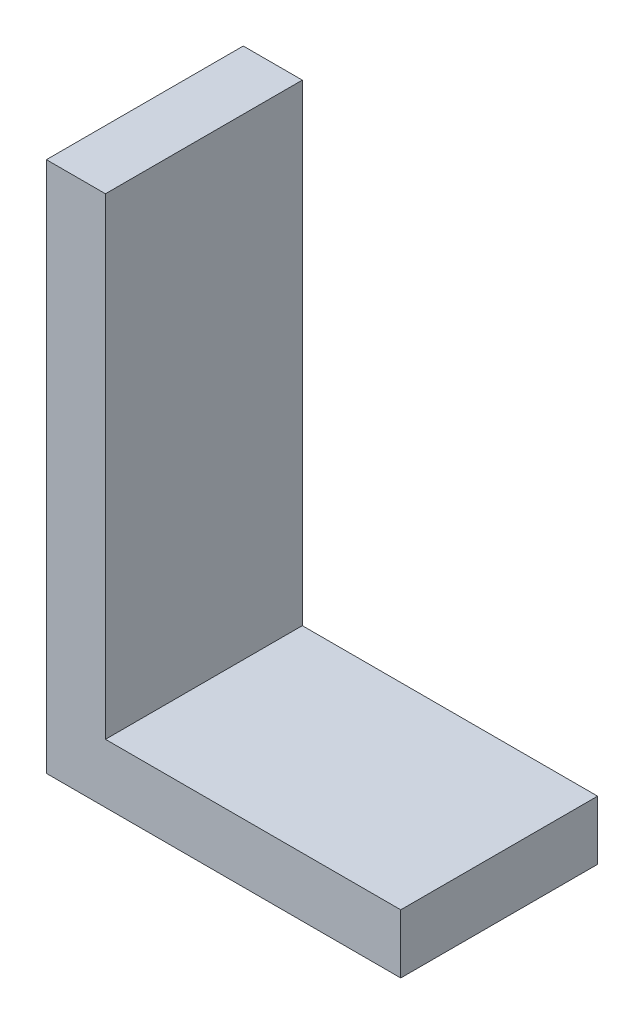
ISO-10303-21;
HEADER;
FILE_DESCRIPTION(('STEP AP214'),'2;1');
FILE_NAME('part.step','',(''),(''),'','','');
FILE_SCHEMA(('AUTOMOTIVE_DESIGN { 1 0 10303 214 1 1 1 1 }'));
ENDSEC;
DATA;
#1=APPLICATION_CONTEXT('core data for automotive mechanical design processes');
#2=APPLICATION_PROTOCOL_DEFINITION('international standard','automotive_design',2000,#1);
#3=PRODUCT_CONTEXT('',#1,'mechanical');
#4=PRODUCT('Part','Part','',(#3));
#5=PRODUCT_RELATED_PRODUCT_CATEGORY('part','',(#4));
#6=PRODUCT_DEFINITION_FORMATION('','',#4);
#7=PRODUCT_DEFINITION_CONTEXT('part definition',#1,'design');
#8=PRODUCT_DEFINITION('design','',#6,#7);
#9=PRODUCT_DEFINITION_SHAPE('','',#8);
#10=(LENGTH_UNIT() NAMED_UNIT(*) SI_UNIT(.MILLI.,.METRE.));
#11=(NAMED_UNIT(*) PLANE_ANGLE_UNIT() SI_UNIT($,.RADIAN.));
#12=(NAMED_UNIT(*) SI_UNIT($,.STERADIAN.) SOLID_ANGLE_UNIT());
#13=UNCERTAINTY_MEASURE_WITH_UNIT(LENGTH_MEASURE(1.E-05),#10,'distance_accuracy_value','');
#14=(GEOMETRIC_REPRESENTATION_CONTEXT(3) GLOBAL_UNCERTAINTY_ASSIGNED_CONTEXT((#13)) GLOBAL_UNIT_ASSIGNED_CONTEXT((#10,
#11,#12)) REPRESENTATION_CONTEXT('',''));
#15=CARTESIAN_POINT('',(0.,0.,0.));
#16=DIRECTION('',(0.,0.,1.));
#17=DIRECTION('',(1.,0.,0.));
#18=AXIS2_PLACEMENT_3D('',#15,#16,#17);
#19=CARTESIAN_POINT('',(3.,0.,10.));
#20=DIRECTION('',(0.,-1.,0.));
#21=DIRECTION('',(1.,0.,0.));
#22=AXIS2_PLACEMENT_3D('',#19,#20,#21);
#23=PLANE('',#22);
#24=DIRECTION('',(-1.,0.,0.));
#25=VECTOR('',#24,1.);
#26=CARTESIAN_POINT('',(3.,0.,0.));
#27=LINE('',#26,#25);
#28=CARTESIAN_POINT('',(3.,0.,0.));
#29=VERTEX_POINT('',#28);
#30=CARTESIAN_POINT('',(0.,0.,0.));
#31=VERTEX_POINT('',#30);
#32=EDGE_CURVE('E117',#29,#31,#27,.T.);
#33=ORIENTED_EDGE('',*,*,#32,.T.);
#34=DIRECTION('',(0.,0.,-1.));
#35=VECTOR('',#34,1.);
#36=CARTESIAN_POINT('',(0.,0.,10.));
#37=LINE('',#36,#35);
#38=CARTESIAN_POINT('',(0.,0.,10.));
#39=VERTEX_POINT('',#38);
#40=EDGE_CURVE('E11',#39,#31,#37,.T.);
#41=ORIENTED_EDGE('',*,*,#40,.F.);
#42=DIRECTION('',(-1.,0.,0.));
#43=VECTOR('',#42,1.);
#44=CARTESIAN_POINT('',(3.,0.,10.));
#45=LINE('',#44,#43);
#46=CARTESIAN_POINT('',(3.,0.,10.));
#47=VERTEX_POINT('',#46);
#48=EDGE_CURVE('E127',#47,#39,#45,.T.);
#49=ORIENTED_EDGE('',*,*,#48,.F.);
#50=DIRECTION('',(0.,0.,-1.));
#51=VECTOR('',#50,1.);
#52=CARTESIAN_POINT('',(3.,0.,10.));
#53=LINE('',#52,#51);
#54=EDGE_CURVE('E113',#47,#29,#53,.T.);
#55=ORIENTED_EDGE('',*,*,#54,.T.);
#56=EDGE_LOOP('',(#33,#41,#49,#55));
#57=FACE_BOUND('',#56,.T.);
#58=ADVANCED_FACE('F33',(#57),#23,.F.);
#59=CARTESIAN_POINT('',(0.,0.,10.));
#60=DIRECTION('',(1.,0.,0.));
#61=DIRECTION('',(0.,0.,-1.));
#62=AXIS2_PLACEMENT_3D('',#59,#60,#61);
#63=PLANE('',#62);
#64=DIRECTION('',(0.,-1.,0.));
#65=VECTOR('',#64,1.);
#66=CARTESIAN_POINT('',(0.,0.,0.));
#67=LINE('',#66,#65);
#68=CARTESIAN_POINT('',(0.,-27.,0.));
#69=VERTEX_POINT('',#68);
#70=EDGE_CURVE('E120',#31,#69,#67,.T.);
#71=ORIENTED_EDGE('',*,*,#70,.T.);
#72=DIRECTION('',(0.,0.,-1.));
#73=VECTOR('',#72,1.);
#74=CARTESIAN_POINT('',(0.,-27.,10.));
#75=LINE('',#74,#73);
#76=CARTESIAN_POINT('',(0.,-27.,10.));
#77=VERTEX_POINT('',#76);
#78=EDGE_CURVE('E41',#77,#69,#75,.T.);
#79=ORIENTED_EDGE('',*,*,#78,.F.);
#80=DIRECTION('',(0.,-1.,0.));
#81=VECTOR('',#80,1.);
#82=CARTESIAN_POINT('',(0.,0.,10.));
#83=LINE('',#82,#81);
#84=EDGE_CURVE('E86',#39,#77,#83,.T.);
#85=ORIENTED_EDGE('',*,*,#84,.F.);
#86=ORIENTED_EDGE('',*,*,#40,.T.);
#87=EDGE_LOOP('',(#71,#79,#85,#86));
#88=FACE_BOUND('',#87,.T.);
#89=ADVANCED_FACE('F151',(#88),#63,.F.);
#90=CARTESIAN_POINT('',(0.,-27.,10.));
#91=DIRECTION('',(0.,1.,0.));
#92=DIRECTION('',(0.,0.,1.));
#93=AXIS2_PLACEMENT_3D('',#90,#91,#92);
#94=PLANE('',#93);
#95=DIRECTION('',(1.,0.,0.));
#96=VECTOR('',#95,1.);
#97=CARTESIAN_POINT('',(0.,-27.,0.));
#98=LINE('',#97,#96);
#99=CARTESIAN_POINT('',(18.,-27.,0.));
#100=VERTEX_POINT('',#99);
#101=EDGE_CURVE('E122',#69,#100,#98,.T.);
#102=ORIENTED_EDGE('',*,*,#101,.T.);
#103=DIRECTION('',(0.,0.,-1.));
#104=VECTOR('',#103,1.);
#105=CARTESIAN_POINT('',(18.,-27.,10.));
#106=LINE('',#105,#104);
#107=CARTESIAN_POINT('',(18.,-27.,10.));
#108=VERTEX_POINT('',#107);
#109=EDGE_CURVE('E108',#108,#100,#106,.T.);
#110=ORIENTED_EDGE('',*,*,#109,.F.);
#111=DIRECTION('',(1.,0.,0.));
#112=VECTOR('',#111,1.);
#113=CARTESIAN_POINT('',(0.,-27.,10.));
#114=LINE('',#113,#112);
#115=EDGE_CURVE('E99',#77,#108,#114,.T.);
#116=ORIENTED_EDGE('',*,*,#115,.F.);
#117=ORIENTED_EDGE('',*,*,#78,.T.);
#118=EDGE_LOOP('',(#102,#110,#116,#117));
#119=FACE_BOUND('',#118,.T.);
#120=ADVANCED_FACE('F133',(#119),#94,.F.);
#121=CARTESIAN_POINT('',(18.,-27.,10.));
#122=DIRECTION('',(-1.,0.,0.));
#123=DIRECTION('',(0.,0.,1.));
#124=AXIS2_PLACEMENT_3D('',#121,#122,#123);
#125=PLANE('',#124);
#126=DIRECTION('',(0.,1.,0.));
#127=VECTOR('',#126,1.);
#128=CARTESIAN_POINT('',(18.,-27.,0.));
#129=LINE('',#128,#127);
#130=CARTESIAN_POINT('',(18.,-24.,0.));
#131=VERTEX_POINT('',#130);
#132=EDGE_CURVE('E107',#100,#131,#129,.T.);
#133=ORIENTED_EDGE('',*,*,#132,.T.);
#134=DIRECTION('',(0.,0.,-1.));
#135=VECTOR('',#134,1.);
#136=CARTESIAN_POINT('',(18.,-24.,10.));
#137=LINE('',#136,#135);
#138=CARTESIAN_POINT('',(18.,-24.,10.));
#139=VERTEX_POINT('',#138);
#140=EDGE_CURVE('E104',#139,#131,#137,.T.);
#141=ORIENTED_EDGE('',*,*,#140,.F.);
#142=DIRECTION('',(0.,1.,0.));
#143=VECTOR('',#142,1.);
#144=CARTESIAN_POINT('',(18.,-27.,10.));
#145=LINE('',#144,#143);
#146=EDGE_CURVE('E93',#108,#139,#145,.T.);
#147=ORIENTED_EDGE('',*,*,#146,.F.);
#148=ORIENTED_EDGE('',*,*,#109,.T.);
#149=EDGE_LOOP('',(#133,#141,#147,#148));
#150=FACE_BOUND('',#149,.T.);
#151=ADVANCED_FACE('F105',(#150),#125,.F.);
#152=CARTESIAN_POINT('',(18.,-24.,10.));
#153=DIRECTION('',(0.,-1.,0.));
#154=DIRECTION('',(1.,0.,0.));
#155=AXIS2_PLACEMENT_3D('',#152,#153,#154);
#156=PLANE('',#155);
#157=DIRECTION('',(-1.,0.,0.));
#158=VECTOR('',#157,1.);
#159=CARTESIAN_POINT('',(18.,-24.,0.));
#160=LINE('',#159,#158);
#161=CARTESIAN_POINT('',(3.,-24.,0.));
#162=VERTEX_POINT('',#161);
#163=EDGE_CURVE('E72',#131,#162,#160,.T.);
#164=ORIENTED_EDGE('',*,*,#163,.T.);
#165=DIRECTION('',(0.,0.,-1.));
#166=VECTOR('',#165,1.);
#167=CARTESIAN_POINT('',(3.,-24.,10.));
#168=LINE('',#167,#166);
#169=CARTESIAN_POINT('',(3.,-24.,10.));
#170=VERTEX_POINT('',#169);
#171=EDGE_CURVE('E109',#170,#162,#168,.T.);
#172=ORIENTED_EDGE('',*,*,#171,.F.);
#173=DIRECTION('',(-1.,0.,0.));
#174=VECTOR('',#173,1.);
#175=CARTESIAN_POINT('',(18.,-24.,10.));
#176=LINE('',#175,#174);
#177=EDGE_CURVE('E97',#139,#170,#176,.T.);
#178=ORIENTED_EDGE('',*,*,#177,.F.);
#179=ORIENTED_EDGE('',*,*,#140,.T.);
#180=EDGE_LOOP('',(#164,#172,#178,#179));
#181=FACE_BOUND('',#180,.T.);
#182=ADVANCED_FACE('F111',(#181),#156,.F.);
#183=CARTESIAN_POINT('',(3.,-24.,10.));
#184=DIRECTION('',(-1.,0.,0.));
#185=DIRECTION('',(0.,-1.,0.));
#186=AXIS2_PLACEMENT_3D('',#183,#184,#185);
#187=PLANE('',#186);
#188=DIRECTION('',(0.,1.,0.));
#189=VECTOR('',#188,1.);
#190=CARTESIAN_POINT('',(3.,-24.,0.));
#191=LINE('',#190,#189);
#192=EDGE_CURVE('E78',#162,#29,#191,.T.);
#193=ORIENTED_EDGE('',*,*,#192,.T.);
#194=ORIENTED_EDGE('',*,*,#54,.F.);
#195=DIRECTION('',(0.,1.,0.));
#196=VECTOR('',#195,1.);
#197=CARTESIAN_POINT('',(3.,-24.,10.));
#198=LINE('',#197,#196);
#199=EDGE_CURVE('E49',#170,#47,#198,.T.);
#200=ORIENTED_EDGE('',*,*,#199,.F.);
#201=ORIENTED_EDGE('',*,*,#171,.T.);
#202=EDGE_LOOP('',(#193,#194,#200,#201));
#203=FACE_BOUND('',#202,.T.);
#204=ADVANCED_FACE('F140',(#203),#187,.F.);
#205=CARTESIAN_POINT('',(0.,0.,10.));
#206=DIRECTION('',(0.,0.,1.));
#207=DIRECTION('',(1.,0.,0.));
#208=AXIS2_PLACEMENT_3D('',#205,#206,#207);
#209=PLANE('',#208);
#210=ORIENTED_EDGE('',*,*,#48,.T.);
#211=ORIENTED_EDGE('',*,*,#84,.T.);
#212=ORIENTED_EDGE('',*,*,#115,.T.);
#213=ORIENTED_EDGE('',*,*,#146,.T.);
#214=ORIENTED_EDGE('',*,*,#177,.T.);
#215=ORIENTED_EDGE('',*,*,#199,.T.);
#216=EDGE_LOOP('',(#210,#211,#212,#213,#214,#215));
#217=FACE_BOUND('',#216,.T.);
#218=ADVANCED_FACE('F95',(#217),#209,.T.);
#219=CARTESIAN_POINT('',(0.,0.,0.));
#220=DIRECTION('',(0.,0.,1.));
#221=DIRECTION('',(1.,0.,0.));
#222=AXIS2_PLACEMENT_3D('',#219,#220,#221);
#223=PLANE('',#222);
#224=ORIENTED_EDGE('',*,*,#32,.F.);
#225=ORIENTED_EDGE('',*,*,#192,.F.);
#226=ORIENTED_EDGE('',*,*,#163,.F.);
#227=ORIENTED_EDGE('',*,*,#132,.F.);
#228=ORIENTED_EDGE('',*,*,#101,.F.);
#229=ORIENTED_EDGE('',*,*,#70,.F.);
#230=EDGE_LOOP('',(#224,#225,#226,#227,#228,#229));
#231=FACE_BOUND('',#230,.T.);
#232=ADVANCED_FACE('F136',(#231),#223,.F.);
#233=CLOSED_SHELL('',(#58,#89,#120,#151,#182,#204,#218,#232));
#234=MANIFOLD_SOLID_BREP('B2',#233);
#235=ADVANCED_BREP_SHAPE_REPRESENTATION('',(#18,#234),#14);
#236=SHAPE_DEFINITION_REPRESENTATION(#9,#235);
ENDSEC;
END-ISO-10303-21;
